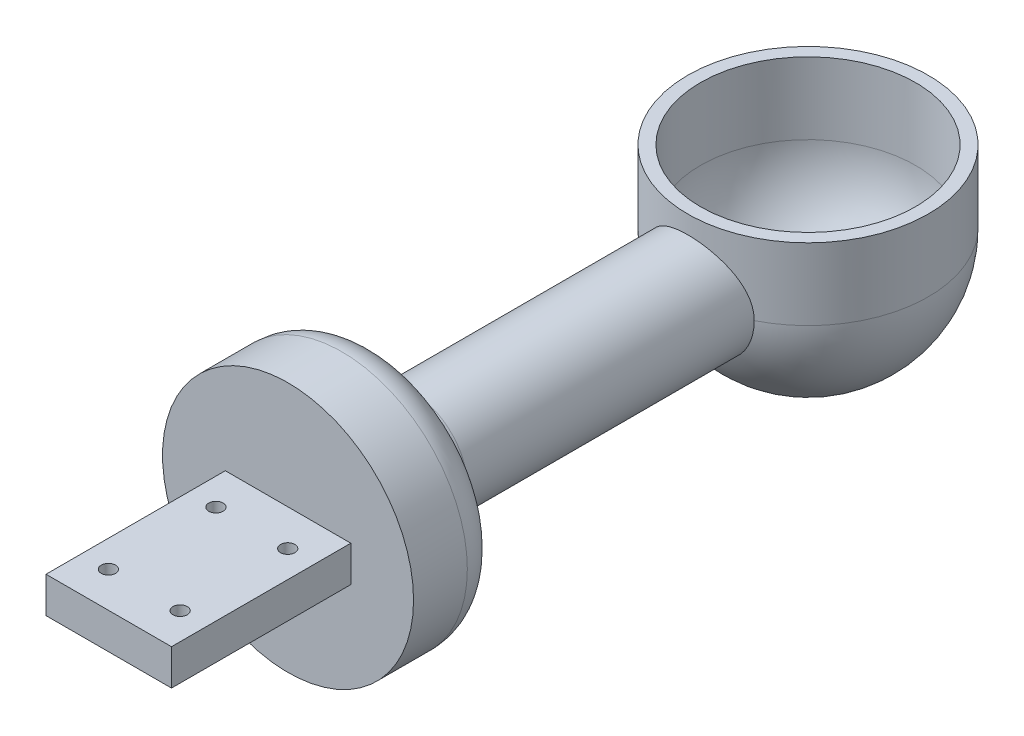
ISO-10303-21;
HEADER;
FILE_DESCRIPTION(('STEP AP214'),'2;1');
FILE_NAME('part.step','',(''),(''),'','','');
FILE_SCHEMA(('AUTOMOTIVE_DESIGN { 1 0 10303 214 1 1 1 1 }'));
ENDSEC;
DATA;
#1=APPLICATION_CONTEXT('core data for automotive mechanical design processes');
#2=APPLICATION_PROTOCOL_DEFINITION('international standard','automotive_design',2000,#1);
#3=PRODUCT_CONTEXT('',#1,'mechanical');
#4=PRODUCT('Part','Part','',(#3));
#5=PRODUCT_RELATED_PRODUCT_CATEGORY('part','',(#4));
#6=PRODUCT_DEFINITION_FORMATION('','',#4);
#7=PRODUCT_DEFINITION_CONTEXT('part definition',#1,'design');
#8=PRODUCT_DEFINITION('design','',#6,#7);
#9=PRODUCT_DEFINITION_SHAPE('','',#8);
#10=(LENGTH_UNIT() NAMED_UNIT(*) SI_UNIT(.MILLI.,.METRE.));
#11=(NAMED_UNIT(*) PLANE_ANGLE_UNIT() SI_UNIT($,.RADIAN.));
#12=(NAMED_UNIT(*) SI_UNIT($,.STERADIAN.) SOLID_ANGLE_UNIT());
#13=UNCERTAINTY_MEASURE_WITH_UNIT(LENGTH_MEASURE(1.E-05),#10,'distance_accuracy_value','');
#14=(GEOMETRIC_REPRESENTATION_CONTEXT(3) GLOBAL_UNCERTAINTY_ASSIGNED_CONTEXT((#13)) GLOBAL_UNIT_ASSIGNED_CONTEXT((#10,
#11,#12)) REPRESENTATION_CONTEXT('',''));
#15=CARTESIAN_POINT('',(0.,0.,0.));
#16=DIRECTION('',(0.,0.,1.));
#17=DIRECTION('',(1.,0.,0.));
#18=AXIS2_PLACEMENT_3D('',#15,#16,#17);
#19=CARTESIAN_POINT('',(0.,0.,-90.));
#20=DIRECTION('',(0.,0.,1.));
#21=DIRECTION('',(1.,0.,0.));
#22=AXIS2_PLACEMENT_3D('',#19,#20,#21);
#23=CYLINDRICAL_SURFACE('',#22,15.);
#24=CARTESIAN_POINT('',(0.,0.,-10.));
#25=DIRECTION('',(0.,0.,1.));
#26=DIRECTION('',(1.,0.,0.));
#27=AXIS2_PLACEMENT_3D('',#24,#25,#26);
#28=CIRCLE('',#27,15.);
#29=CARTESIAN_POINT('',(15.,0.,-10.));
#30=VERTEX_POINT('',#29);
#31=EDGE_CURVE('E11',#30,#30,#28,.F.);
#32=ORIENTED_EDGE('',*,*,#31,.T.);
#33=EDGE_LOOP('',(#32));
#34=FACE_BOUND('',#33,.T.);
#35=CARTESIAN_POINT('',(-15.,-1.04744440165294E-13,-90.));
#36=CARTESIAN_POINT('',(-15.0000011180629,0.199416589910186,-90.0000037148961));
#37=CARTESIAN_POINT('',(-14.9960224853218,0.398805978197176,-89.998010854561));
#38=CARTESIAN_POINT('',(-14.9801283069365,0.797180509822262,-89.9900704651956));
#39=CARTESIAN_POINT('',(-14.9682131159363,0.996165670824701,-89.9841231128713));
#40=CARTESIAN_POINT('',(-14.9206184180502,1.59173695595978,-89.9604179060455));
#41=CARTESIAN_POINT('',(-14.8730897168406,1.98722084661047,-89.9367967948438));
#42=CARTESIAN_POINT('',(-14.7473070501445,2.77009963093872,-89.8748978964644));
#43=CARTESIAN_POINT('',(-14.6691994107504,3.15752392799824,-89.8366899314931));
#44=CARTESIAN_POINT('',(-14.4831241955067,3.92357968353081,-89.7469047750654));
#45=CARTESIAN_POINT('',(-14.3751541255042,4.30221040468735,-89.6953264669215));
#46=CARTESIAN_POINT('',(-14.1306735404263,5.04753769249703,-89.5805614421511));
#47=CARTESIAN_POINT('',(-13.9942143462563,5.41425436699086,-89.5173956239988));
#48=CARTESIAN_POINT('',(-13.6937986230489,6.13450910976831,-89.3812628373903));
#49=CARTESIAN_POINT('',(-13.5298315317518,6.48804205189148,-89.3082921062736));
#50=CARTESIAN_POINT('',(-13.1755411058944,7.18028163573275,-89.1545396757981));
#51=CARTESIAN_POINT('',(-12.9851935588092,7.51897427649915,-89.0737508215976));
#52=CARTESIAN_POINT('',(-12.5795221840015,8.17960237846895,-88.9065320797501));
#53=CARTESIAN_POINT('',(-12.3641966284751,8.50153667821338,-88.8201018020499));
#54=CARTESIAN_POINT('',(-11.8950684339012,9.14750544243964,-88.6380057850135));
#55=CARTESIAN_POINT('',(-11.6396754045569,9.47031953458519,-88.5421047435388));
#56=CARTESIAN_POINT('',(-11.1035908057363,10.0935206330415,-88.3489114102079));
#57=CARTESIAN_POINT('',(-10.8229088968001,10.3939161239198,-88.2516196614616));
#58=CARTESIAN_POINT('',(-10.2374738340366,10.9710149380681,-88.0580335091681));
#59=CARTESIAN_POINT('',(-9.93270589967413,11.2477034929777,-87.9617397596895));
#60=CARTESIAN_POINT('',(-9.30093629991512,11.7754806430082,-87.7726628513661));
#61=CARTESIAN_POINT('',(-8.97394287218653,12.0265786377073,-87.6798784114617));
#62=CARTESIAN_POINT('',(-8.28183202582192,12.5139732304049,-87.4954460793731));
#63=CARTESIAN_POINT('',(-7.91561743238008,12.7488317132162,-87.4041054035966));
#64=CARTESIAN_POINT('',(-7.16253060249632,13.1866546295904,-87.2303880058701));
#65=CARTESIAN_POINT('',(-6.77565745487947,13.3896176547995,-87.1480116797931));
#66=CARTESIAN_POINT('',(-5.98395480508338,13.7616676742179,-86.9946250642922));
#67=CARTESIAN_POINT('',(-5.57913247255109,13.9307680483003,-86.9236102879106));
#68=CARTESIAN_POINT('',(-4.75433388647185,14.2333842203932,-86.7950237558998));
#69=CARTESIAN_POINT('',(-4.33435888193996,14.366902943779,-86.7374508951803));
#70=CARTESIAN_POINT('',(-3.50767666791516,14.590015936155,-86.6404573306008));
#71=CARTESIAN_POINT('',(-3.10164394955037,14.6817333584565,-86.6001675166512));
#72=CARTESIAN_POINT('',(-2.28220011512519,14.8312167328056,-86.5341894139035));
#73=CARTESIAN_POINT('',(-1.86878926467154,14.8889839045047,-86.5085006005705));
#74=CARTESIAN_POINT('',(-1.03808300988868,14.9698522016162,-86.4724715516371));
#75=CARTESIAN_POINT('',(-0.62078915128018,14.9929665733472,-86.4621254511746));
#76=CARTESIAN_POINT('',(0.214358016966454,15.0042801958997,-86.4570664608494));
#77=CARTESIAN_POINT('',(0.632211299970708,14.9924810537102,-86.462352851459));
#78=CARTESIAN_POINT('',(1.43580383130276,14.9361701374916,-86.4874856680707));
#79=CARTESIAN_POINT('',(1.82174313643298,14.8940066423059,-86.506286730574));
#80=CARTESIAN_POINT('',(2.58834742653606,14.7800746615488,-86.5567944485834));
#81=CARTESIAN_POINT('',(2.96901270566484,14.7083078340134,-86.5885003813068));
#82=CARTESIAN_POINT('',(3.72250973283779,14.5358971896879,-86.6640387868198));
#83=CARTESIAN_POINT('',(4.09534136451526,14.4352529442567,-86.7078714396117));
#84=CARTESIAN_POINT('',(4.83081047190126,14.2060426513355,-86.8066127438228));
#85=CARTESIAN_POINT('',(5.19344762024909,14.0774757083585,-86.861521750459));
#86=CARTESIAN_POINT('',(5.91179502253241,13.7913889952906,-86.9820453334529));
#87=CARTESIAN_POINT('',(6.26731691895285,13.6334598448268,-87.0478095880111));
#88=CARTESIAN_POINT('',(6.96367359048728,13.2912665259131,-87.1879076276429));
#89=CARTESIAN_POINT('',(7.30450834071185,13.1070023128372,-87.2622414272381));
#90=CARTESIAN_POINT('',(7.96980043256244,12.7134448464105,-87.4178114537079));
#91=CARTESIAN_POINT('',(8.29425570146961,12.5041484366291,-87.499048550678));
#92=CARTESIAN_POINT('',(8.92532349722544,12.0618054885513,-87.666654258308));
#93=CARTESIAN_POINT('',(9.23192903029872,11.828749738105,-87.7530248539127));
#94=CARTESIAN_POINT('',(9.84931358096797,11.3209177798672,-87.9359591333702));
#95=CARTESIAN_POINT('',(10.1585003269739,11.0442992315663,-88.0327883707272));
#96=CARTESIAN_POINT('',(10.7527219725689,10.4666463994513,-88.22773577681));
#97=CARTESIAN_POINT('',(11.0377559165426,10.1656111505022,-88.3258539963577));
#98=CARTESIAN_POINT('',(11.5822760248514,9.54058470286612,-88.5208867448796));
#99=CARTESIAN_POINT('',(11.8417483349736,9.21658121737168,-88.6178005965009));
#100=CARTESIAN_POINT('',(12.3334750963352,8.54738714704059,-88.8077751388214));
#101=CARTESIAN_POINT('',(12.5657252628454,8.20219323985374,-88.9008352214558));
#102=CARTESIAN_POINT('',(13.0108912191868,7.47699726433028,-89.0843536754966));
#103=CARTESIAN_POINT('',(13.222527327955,7.09613433575536,-89.1745230066981));
#104=CARTESIAN_POINT('',(13.6125368931575,6.31577560604006,-89.344753768404));
#105=CARTESIAN_POINT('',(13.7909250205786,5.91628812090955,-89.4248196520894));
#106=CARTESIAN_POINT('',(14.1125390816283,5.101728564824,-89.5719288688148));
#107=CARTESIAN_POINT('',(14.2558158726059,4.68668005094591,-89.638991007487));
#108=CARTESIAN_POINT('',(14.5058126992639,3.8437784282941,-89.7576367928758));
#109=CARTESIAN_POINT('',(14.6125489188063,3.41593107967774,-89.8092272907414));
#110=CARTESIAN_POINT('',(14.7995674188792,2.49428431295931,-89.9004117413249));
#111=CARTESIAN_POINT('',(14.874598763435,1.99914850582797,-89.9375704751888));
#112=CARTESIAN_POINT('',(14.9497623478576,1.25197348693031,-89.9749225599125));
#113=CARTESIAN_POINT('',(14.9685863308069,1.0021108723786,-89.9843089620925));
#114=CARTESIAN_POINT('',(14.9937082944507,0.501518332050936,-89.9968531555581));
#115=CARTESIAN_POINT('',(15.0000021267999,0.250788146560293,-90.0000088840576));
#116=CARTESIAN_POINT('',(15.,1.04003962709049E-13,-90.));
#117=B_SPLINE_CURVE_WITH_KNOTS('',3,(#35,#36,#37,#38,#39,#40,#41,#42,#43,#44,#45,#46,#47,#48,
#49,#50,#51,#52,#53,#54,#55,#56,#57,#58,#59,#60,#61,#62,#63,#64,#65,#66,#67,#68,#69,#70,#71,#72,
#73,#74,#75,#76,#77,#78,#79,#80,#81,#82,#83,#84,#85,#86,#87,#88,#89,#90,#91,#92,#93,#94,#95,#96,
#97,#98,#99,#100,#101,#102,#103,#104,#105,#106,#107,#108,#109,#110,#111,#112,#113,#114,#115,
#116),.UNSPECIFIED.,.F.,.F.,(4,2,2,2,2,2,2,2,2,2,2,2,2,2,2,2,2,2,2,2,2,2,2,2,2,2,2,2,2,2,2,2,2,
2,2,2,2,2,2,2,4),(0.,0.598146267561977,1.19626580883539,2.39166202418831,3.58140661379114,
4.77125060257797,5.95896939557434,7.14714528741016,8.33641902400184,9.52577507533965,
10.7923407861747,12.0584246944651,13.3252916672707,14.5916916217429,15.9236180490635,
17.255603271497,18.5870611544967,19.9184095367731,21.1713789173376,22.424303282647,
23.6767485850565,24.9291362411771,26.0938356669318,27.2584698685635,28.4231213583082,
29.5878102042034,30.7701558951799,31.9525035897263,33.1350005297013,34.3179577126978,
35.5945940567146,36.8712808877967,38.1486559099286,39.42623171996,40.7593549429063,
42.0918885126344,43.4224803992526,44.7524822004209,46.2555824752882,47.0074849758322,
47.7596363666754),.UNSPECIFIED.);
#118=CARTESIAN_POINT('',(-15.,-1.04744440165294E-13,-90.));
#119=VERTEX_POINT('',#118);
#120=CARTESIAN_POINT('',(15.,1.04744440165294E-13,-90.));
#121=VERTEX_POINT('',#120);
#122=EDGE_CURVE('E98',#119,#121,#117,.T.);
#123=ORIENTED_EDGE('',*,*,#122,.F.);
#124=CARTESIAN_POINT('',(0.,0.,-90.));
#125=DIRECTION('',(0.,0.,-1.));
#126=DIRECTION('',(-1.,0.,0.));
#127=AXIS2_PLACEMENT_3D('',#124,#125,#126);
#128=CIRCLE('',#127,15.);
#129=EDGE_CURVE('E107',#121,#119,#128,.T.);
#130=ORIENTED_EDGE('',*,*,#129,.F.);
#131=EDGE_LOOP('',(#123,#130));
#132=FACE_BOUND('',#131,.T.);
#133=ADVANCED_FACE('F39',(#34,#132),#23,.T.);
#134=CARTESIAN_POINT('',(0.,0.,25.));
#135=DIRECTION('',(0.,0.,1.));
#136=DIRECTION('',(1.,0.,0.));
#137=AXIS2_PLACEMENT_3D('',#134,#135,#136);
#138=PLANE('',#137);
#139=CARTESIAN_POINT('',(0.,0.,25.));
#140=DIRECTION('',(0.,0.,1.));
#141=DIRECTION('',(1.,0.,0.));
#142=AXIS2_PLACEMENT_3D('',#139,#140,#141);
#143=CIRCLE('',#142,35.);
#144=CARTESIAN_POINT('',(35.,0.,25.));
#145=VERTEX_POINT('',#144);
#146=EDGE_CURVE('E113',#145,#145,#143,.T.);
#147=ORIENTED_EDGE('',*,*,#146,.T.);
#148=EDGE_LOOP('',(#147));
#149=FACE_BOUND('',#148,.T.);
#150=DIRECTION('',(0.,-1.,0.));
#151=VECTOR('',#150,1.);
#152=CARTESIAN_POINT('',(17.5,5.,25.));
#153=LINE('',#152,#151);
#154=CARTESIAN_POINT('',(17.5,5.,25.));
#155=VERTEX_POINT('',#154);
#156=CARTESIAN_POINT('',(17.5,-5.,25.));
#157=VERTEX_POINT('',#156);
#158=EDGE_CURVE('E120',#155,#157,#153,.T.);
#159=ORIENTED_EDGE('',*,*,#158,.T.);
#160=DIRECTION('',(-1.,0.,0.));
#161=VECTOR('',#160,1.);
#162=CARTESIAN_POINT('',(-17.5,-5.,25.));
#163=LINE('',#162,#161);
#164=CARTESIAN_POINT('',(-17.5,-5.,25.));
#165=VERTEX_POINT('',#164);
#166=EDGE_CURVE('E215',#157,#165,#163,.T.);
#167=ORIENTED_EDGE('',*,*,#166,.T.);
#168=DIRECTION('',(0.,-1.,0.));
#169=VECTOR('',#168,1.);
#170=CARTESIAN_POINT('',(-17.5,5.,25.));
#171=LINE('',#170,#169);
#172=CARTESIAN_POINT('',(-17.5,5.,25.));
#173=VERTEX_POINT('',#172);
#174=EDGE_CURVE('E211',#173,#165,#171,.T.);
#175=ORIENTED_EDGE('',*,*,#174,.F.);
#176=DIRECTION('',(-1.,0.,0.));
#177=VECTOR('',#176,1.);
#178=CARTESIAN_POINT('',(-17.5,5.,25.));
#179=LINE('',#178,#177);
#180=EDGE_CURVE('E224',#155,#173,#179,.T.);
#181=ORIENTED_EDGE('',*,*,#180,.F.);
#182=EDGE_LOOP('',(#159,#167,#175,#181));
#183=FACE_BOUND('',#182,.T.);
#184=ADVANCED_FACE('F144',(#149,#183),#138,.T.);
#185=CARTESIAN_POINT('',(0.,0.,25.));
#186=DIRECTION('',(0.,0.,-1.));
#187=DIRECTION('',(-1.,0.,0.));
#188=AXIS2_PLACEMENT_3D('',#185,#186,#187);
#189=CYLINDRICAL_SURFACE('',#188,35.);
#190=CARTESIAN_POINT('',(0.,0.,10.));
#191=DIRECTION('',(0.,0.,1.));
#192=DIRECTION('',(1.,0.,0.));
#193=AXIS2_PLACEMENT_3D('',#190,#191,#192);
#194=CIRCLE('',#193,35.);
#195=CARTESIAN_POINT('',(35.,0.,10.));
#196=VERTEX_POINT('',#195);
#197=EDGE_CURVE('E49',#196,#196,#194,.T.);
#198=ORIENTED_EDGE('',*,*,#197,.T.);
#199=EDGE_LOOP('',(#198));
#200=FACE_BOUND('',#199,.T.);
#201=ORIENTED_EDGE('',*,*,#146,.F.);
#202=EDGE_LOOP('',(#201));
#203=FACE_BOUND('',#202,.T.);
#204=ADVANCED_FACE('F128',(#200,#203),#189,.T.);
#205=CARTESIAN_POINT('',(0.,0.,-9.99999999999999));
#206=DIRECTION('',(0.,0.,1.));
#207=DIRECTION('',(1.,0.,0.));
#208=AXIS2_PLACEMENT_3D('',#205,#206,#207);
#209=TOROIDAL_SURFACE('',#208,25.,10.);
#210=ORIENTED_EDGE('',*,*,#31,.F.);
#211=EDGE_LOOP('',(#210));
#212=FACE_BOUND('',#211,.T.);
#213=CARTESIAN_POINT('',(0.,0.,0.));
#214=DIRECTION('',(0.,0.,1.));
#215=DIRECTION('',(1.,0.,0.));
#216=AXIS2_PLACEMENT_3D('',#213,#214,#215);
#217=CIRCLE('',#216,25.);
#218=CARTESIAN_POINT('',(25.,0.,0.));
#219=VERTEX_POINT('',#218);
#220=EDGE_CURVE('E43',#219,#219,#217,.T.);
#221=ORIENTED_EDGE('',*,*,#220,.F.);
#222=EDGE_LOOP('',(#221));
#223=FACE_BOUND('',#222,.T.);
#224=ADVANCED_FACE('F41',(#212,#223),#209,.F.);
#225=CARTESIAN_POINT('',(0.,0.,10.));
#226=DIRECTION('',(0.,0.,1.));
#227=DIRECTION('',(1.,0.,0.));
#228=AXIS2_PLACEMENT_3D('',#225,#226,#227);
#229=TOROIDAL_SURFACE('',#228,25.,10.);
#230=ORIENTED_EDGE('',*,*,#220,.T.);
#231=EDGE_LOOP('',(#230));
#232=FACE_BOUND('',#231,.T.);
#233=ORIENTED_EDGE('',*,*,#197,.F.);
#234=EDGE_LOOP('',(#233));
#235=FACE_BOUND('',#234,.T.);
#236=ADVANCED_FACE('F131',(#232,#235),#229,.T.);
#237=CARTESIAN_POINT('',(0.,5.,0.));
#238=DIRECTION('',(0.,-1.,0.));
#239=DIRECTION('',(0.,0.,-1.));
#240=AXIS2_PLACEMENT_3D('',#237,#238,#239);
#241=PLANE('',#240);
#242=DIRECTION('',(0.,0.,-1.));
#243=VECTOR('',#242,1.);
#244=CARTESIAN_POINT('',(17.5,5.,75.));
#245=LINE('',#244,#243);
#246=CARTESIAN_POINT('',(17.5,5.,75.));
#247=VERTEX_POINT('',#246);
#248=EDGE_CURVE('E87',#247,#155,#245,.T.);
#249=ORIENTED_EDGE('',*,*,#248,.T.);
#250=ORIENTED_EDGE('',*,*,#180,.T.);
#251=DIRECTION('',(0.,0.,1.));
#252=VECTOR('',#251,1.);
#253=CARTESIAN_POINT('',(-17.5,5.,75.));
#254=LINE('',#253,#252);
#255=CARTESIAN_POINT('',(-17.5,5.,75.));
#256=VERTEX_POINT('',#255);
#257=EDGE_CURVE('E235',#173,#256,#254,.T.);
#258=ORIENTED_EDGE('',*,*,#257,.T.);
#259=DIRECTION('',(1.,0.,0.));
#260=VECTOR('',#259,1.);
#261=CARTESIAN_POINT('',(-17.5,5.,75.));
#262=LINE('',#261,#260);
#263=EDGE_CURVE('E65',#256,#247,#262,.T.);
#264=ORIENTED_EDGE('',*,*,#263,.T.);
#265=EDGE_LOOP('',(#249,#250,#258,#264));
#266=FACE_BOUND('',#265,.T.);
#267=CARTESIAN_POINT('',(-10.,5.,35.1));
#268=DIRECTION('',(0.,1.,0.));
#269=DIRECTION('',(0.,0.,1.));
#270=AXIS2_PLACEMENT_3D('',#267,#268,#269);
#271=CIRCLE('',#270,2.);
#272=CARTESIAN_POINT('',(-10.,5.,37.1));
#273=VERTEX_POINT('',#272);
#274=EDGE_CURVE('E244',#273,#273,#271,.T.);
#275=ORIENTED_EDGE('',*,*,#274,.F.);
#276=EDGE_LOOP('',(#275));
#277=FACE_BOUND('',#276,.T.);
#278=CARTESIAN_POINT('',(10.,5.,35.1));
#279=DIRECTION('',(0.,1.,0.));
#280=DIRECTION('',(0.,0.,1.));
#281=AXIS2_PLACEMENT_3D('',#278,#279,#280);
#282=CIRCLE('',#281,2.);
#283=CARTESIAN_POINT('',(10.,5.,37.1));
#284=VERTEX_POINT('',#283);
#285=EDGE_CURVE('E253',#284,#284,#282,.T.);
#286=ORIENTED_EDGE('',*,*,#285,.F.);
#287=EDGE_LOOP('',(#286));
#288=FACE_BOUND('',#287,.T.);
#289=CARTESIAN_POINT('',(10.,5.,65.1));
#290=DIRECTION('',(0.,1.,0.));
#291=DIRECTION('',(0.,0.,1.));
#292=AXIS2_PLACEMENT_3D('',#289,#290,#291);
#293=CIRCLE('',#292,2.);
#294=CARTESIAN_POINT('',(10.,5.,67.1));
#295=VERTEX_POINT('',#294);
#296=EDGE_CURVE('E260',#295,#295,#293,.T.);
#297=ORIENTED_EDGE('',*,*,#296,.F.);
#298=EDGE_LOOP('',(#297));
#299=FACE_BOUND('',#298,.T.);
#300=CARTESIAN_POINT('',(-10.,5.,65.1));
#301=DIRECTION('',(0.,1.,0.));
#302=DIRECTION('',(0.,0.,1.));
#303=AXIS2_PLACEMENT_3D('',#300,#301,#302);
#304=CIRCLE('',#303,2.);
#305=CARTESIAN_POINT('',(-10.,5.,67.1));
#306=VERTEX_POINT('',#305);
#307=EDGE_CURVE('E268',#306,#306,#304,.T.);
#308=ORIENTED_EDGE('',*,*,#307,.F.);
#309=EDGE_LOOP('',(#308));
#310=FACE_BOUND('',#309,.T.);
#311=ADVANCED_FACE('F133',(#266,#277,#288,#299,#310),#241,.F.);
#312=CARTESIAN_POINT('',(0.,-5.,0.));
#313=DIRECTION('',(0.,-1.,0.));
#314=DIRECTION('',(0.,0.,-1.));
#315=AXIS2_PLACEMENT_3D('',#312,#313,#314);
#316=PLANE('',#315);
#317=CARTESIAN_POINT('',(10.,-5.,65.1));
#318=DIRECTION('',(0.,1.,0.));
#319=DIRECTION('',(0.,0.,1.));
#320=AXIS2_PLACEMENT_3D('',#317,#318,#319);
#321=CIRCLE('',#320,2.);
#322=CARTESIAN_POINT('',(10.,-5.,67.1));
#323=VERTEX_POINT('',#322);
#324=EDGE_CURVE('E264',#323,#323,#321,.T.);
#325=ORIENTED_EDGE('',*,*,#324,.T.);
#326=EDGE_LOOP('',(#325));
#327=FACE_BOUND('',#326,.T.);
#328=CARTESIAN_POINT('',(-10.,-5.,35.1));
#329=DIRECTION('',(0.,1.,0.));
#330=DIRECTION('',(0.,0.,1.));
#331=AXIS2_PLACEMENT_3D('',#328,#329,#330);
#332=CIRCLE('',#331,2.);
#333=CARTESIAN_POINT('',(-10.,-5.,37.1));
#334=VERTEX_POINT('',#333);
#335=EDGE_CURVE('E249',#334,#334,#332,.T.);
#336=ORIENTED_EDGE('',*,*,#335,.T.);
#337=EDGE_LOOP('',(#336));
#338=FACE_BOUND('',#337,.T.);
#339=DIRECTION('',(0.,0.,-1.));
#340=VECTOR('',#339,1.);
#341=CARTESIAN_POINT('',(17.5,-5.,75.));
#342=LINE('',#341,#340);
#343=CARTESIAN_POINT('',(17.5,-5.,75.));
#344=VERTEX_POINT('',#343);
#345=EDGE_CURVE('E56',#344,#157,#342,.T.);
#346=ORIENTED_EDGE('',*,*,#345,.F.);
#347=DIRECTION('',(1.,0.,0.));
#348=VECTOR('',#347,1.);
#349=CARTESIAN_POINT('',(-17.5,-5.,75.));
#350=LINE('',#349,#348);
#351=CARTESIAN_POINT('',(-17.5,-5.,75.));
#352=VERTEX_POINT('',#351);
#353=EDGE_CURVE('E83',#352,#344,#350,.T.);
#354=ORIENTED_EDGE('',*,*,#353,.F.);
#355=DIRECTION('',(0.,0.,1.));
#356=VECTOR('',#355,1.);
#357=CARTESIAN_POINT('',(-17.5,-5.,75.));
#358=LINE('',#357,#356);
#359=EDGE_CURVE('E207',#165,#352,#358,.T.);
#360=ORIENTED_EDGE('',*,*,#359,.F.);
#361=ORIENTED_EDGE('',*,*,#166,.F.);
#362=EDGE_LOOP('',(#346,#354,#360,#361));
#363=FACE_BOUND('',#362,.T.);
#364=CARTESIAN_POINT('',(10.,-5.,35.1));
#365=DIRECTION('',(0.,1.,0.));
#366=DIRECTION('',(0.,0.,1.));
#367=AXIS2_PLACEMENT_3D('',#364,#365,#366);
#368=CIRCLE('',#367,2.);
#369=CARTESIAN_POINT('',(10.,-5.,37.1));
#370=VERTEX_POINT('',#369);
#371=EDGE_CURVE('E256',#370,#370,#368,.T.);
#372=ORIENTED_EDGE('',*,*,#371,.T.);
#373=EDGE_LOOP('',(#372));
#374=FACE_BOUND('',#373,.T.);
#375=CARTESIAN_POINT('',(-10.,-5.,65.1));
#376=DIRECTION('',(0.,1.,0.));
#377=DIRECTION('',(0.,0.,1.));
#378=AXIS2_PLACEMENT_3D('',#375,#376,#377);
#379=CIRCLE('',#378,2.);
#380=CARTESIAN_POINT('',(-10.,-5.,67.1));
#381=VERTEX_POINT('',#380);
#382=EDGE_CURVE('E103',#381,#381,#379,.T.);
#383=ORIENTED_EDGE('',*,*,#382,.T.);
#384=EDGE_LOOP('',(#383));
#385=FACE_BOUND('',#384,.T.);
#386=ADVANCED_FACE('F139',(#327,#338,#363,#374,#385),#316,.T.);
#387=CARTESIAN_POINT('',(17.5,5.,75.));
#388=DIRECTION('',(-1.,0.,0.));
#389=DIRECTION('',(0.,0.,1.));
#390=AXIS2_PLACEMENT_3D('',#387,#388,#389);
#391=PLANE('',#390);
#392=ORIENTED_EDGE('',*,*,#345,.T.);
#393=ORIENTED_EDGE('',*,*,#158,.F.);
#394=ORIENTED_EDGE('',*,*,#248,.F.);
#395=DIRECTION('',(0.,-1.,0.));
#396=VECTOR('',#395,1.);
#397=CARTESIAN_POINT('',(17.5,5.,75.));
#398=LINE('',#397,#396);
#399=EDGE_CURVE('E218',#247,#344,#398,.T.);
#400=ORIENTED_EDGE('',*,*,#399,.T.);
#401=EDGE_LOOP('',(#392,#393,#394,#400));
#402=FACE_BOUND('',#401,.T.);
#403=ADVANCED_FACE('F154',(#402),#391,.F.);
#404=CARTESIAN_POINT('',(-17.5,5.,75.));
#405=DIRECTION('',(1.,0.,0.));
#406=DIRECTION('',(0.,0.,-1.));
#407=AXIS2_PLACEMENT_3D('',#404,#405,#406);
#408=PLANE('',#407);
#409=ORIENTED_EDGE('',*,*,#359,.T.);
#410=DIRECTION('',(0.,-1.,0.));
#411=VECTOR('',#410,1.);
#412=CARTESIAN_POINT('',(-17.5,5.,75.));
#413=LINE('',#412,#411);
#414=EDGE_CURVE('E209',#256,#352,#413,.T.);
#415=ORIENTED_EDGE('',*,*,#414,.F.);
#416=ORIENTED_EDGE('',*,*,#257,.F.);
#417=ORIENTED_EDGE('',*,*,#174,.T.);
#418=EDGE_LOOP('',(#409,#415,#416,#417));
#419=FACE_BOUND('',#418,.T.);
#420=ADVANCED_FACE('F199',(#419),#408,.F.);
#421=CARTESIAN_POINT('',(-17.5,5.,75.));
#422=DIRECTION('',(0.,0.,-1.));
#423=DIRECTION('',(-1.,0.,0.));
#424=AXIS2_PLACEMENT_3D('',#421,#422,#423);
#425=PLANE('',#424);
#426=ORIENTED_EDGE('',*,*,#353,.T.);
#427=ORIENTED_EDGE('',*,*,#399,.F.);
#428=ORIENTED_EDGE('',*,*,#263,.F.);
#429=ORIENTED_EDGE('',*,*,#414,.T.);
#430=EDGE_LOOP('',(#426,#427,#428,#429));
#431=FACE_BOUND('',#430,.T.);
#432=ADVANCED_FACE('F192',(#431),#425,.F.);
#433=CARTESIAN_POINT('',(-10.,5.,35.1));
#434=DIRECTION('',(0.,-1.,0.));
#435=DIRECTION('',(0.,0.,-1.));
#436=AXIS2_PLACEMENT_3D('',#433,#434,#435);
#437=CYLINDRICAL_SURFACE('',#436,2.);
#438=ORIENTED_EDGE('',*,*,#274,.T.);
#439=EDGE_LOOP('',(#438));
#440=FACE_BOUND('',#439,.T.);
#441=ORIENTED_EDGE('',*,*,#335,.F.);
#442=EDGE_LOOP('',(#441));
#443=FACE_BOUND('',#442,.T.);
#444=ADVANCED_FACE('F189',(#440,#443),#437,.F.);
#445=CARTESIAN_POINT('',(10.,5.,35.1));
#446=DIRECTION('',(0.,-1.,0.));
#447=DIRECTION('',(0.,0.,-1.));
#448=AXIS2_PLACEMENT_3D('',#445,#446,#447);
#449=CYLINDRICAL_SURFACE('',#448,2.);
#450=ORIENTED_EDGE('',*,*,#285,.T.);
#451=EDGE_LOOP('',(#450));
#452=FACE_BOUND('',#451,.T.);
#453=ORIENTED_EDGE('',*,*,#371,.F.);
#454=EDGE_LOOP('',(#453));
#455=FACE_BOUND('',#454,.T.);
#456=ADVANCED_FACE('F185',(#452,#455),#449,.F.);
#457=CARTESIAN_POINT('',(10.,5.,65.1));
#458=DIRECTION('',(0.,-1.,0.));
#459=DIRECTION('',(0.,0.,-1.));
#460=AXIS2_PLACEMENT_3D('',#457,#458,#459);
#461=CYLINDRICAL_SURFACE('',#460,2.);
#462=ORIENTED_EDGE('',*,*,#296,.T.);
#463=EDGE_LOOP('',(#462));
#464=FACE_BOUND('',#463,.T.);
#465=ORIENTED_EDGE('',*,*,#324,.F.);
#466=EDGE_LOOP('',(#465));
#467=FACE_BOUND('',#466,.T.);
#468=ADVANCED_FACE('F181',(#464,#467),#461,.F.);
#469=CARTESIAN_POINT('',(-10.,5.,65.1));
#470=DIRECTION('',(0.,-1.,0.));
#471=DIRECTION('',(0.,0.,-1.));
#472=AXIS2_PLACEMENT_3D('',#469,#470,#471);
#473=CYLINDRICAL_SURFACE('',#472,2.);
#474=ORIENTED_EDGE('',*,*,#307,.T.);
#475=EDGE_LOOP('',(#474));
#476=FACE_BOUND('',#475,.T.);
#477=ORIENTED_EDGE('',*,*,#382,.F.);
#478=EDGE_LOOP('',(#477));
#479=FACE_BOUND('',#478,.T.);
#480=ADVANCED_FACE('F178',(#476,#479),#473,.F.);
#481=CARTESIAN_POINT('',(0.,0.,-120.));
#482=DIRECTION('',(0.,0.,-1.));
#483=DIRECTION('',(1.,0.,0.));
#484=AXIS2_PLACEMENT_3D('',#481,#482,#483);
#485=SPHERICAL_SURFACE('',#484,33.5410196624968);
#486=CARTESIAN_POINT('',(0.,0.,-120.));
#487=DIRECTION('',(0.,-1.,0.));
#488=DIRECTION('',(0.,0.,1.));
#489=AXIS2_PLACEMENT_3D('',#486,#487,#488);
#490=CIRCLE('',#489,33.5410196624968);
#491=EDGE_CURVE('E95',#119,#121,#490,.T.);
#492=ORIENTED_EDGE('',*,*,#491,.T.);
#493=ORIENTED_EDGE('',*,*,#129,.T.);
#494=EDGE_LOOP('',(#492,#493));
#495=FACE_BOUND('',#494,.T.);
#496=ADVANCED_FACE('F111',(#495),#485,.T.);
#497=CARTESIAN_POINT('',(-1.28637432361399E-13,20.,-120.));
#498=DIRECTION('',(0.,-1.,0.));
#499=DIRECTION('',(1.,0.,0.));
#500=AXIS2_PLACEMENT_3D('',#497,#498,#499);
#501=CYLINDRICAL_SURFACE('',#500,33.5410196624969);
#502=CARTESIAN_POINT('',(-1.28637432361399E-13,20.,-120.));
#503=DIRECTION('',(0.,1.,0.));
#504=DIRECTION('',(-1.,0.,0.));
#505=AXIS2_PLACEMENT_3D('',#502,#503,#504);
#506=CIRCLE('',#505,33.5410196624969);
#507=CARTESIAN_POINT('',(-33.541019662497,19.9999999999998,-120.));
#508=VERTEX_POINT('',#507);
#509=EDGE_CURVE('E109',#508,#508,#506,.T.);
#510=ORIENTED_EDGE('',*,*,#509,.F.);
#511=EDGE_LOOP('',(#510));
#512=FACE_BOUND('',#511,.T.);
#513=ORIENTED_EDGE('',*,*,#491,.F.);
#514=ORIENTED_EDGE('',*,*,#122,.T.);
#515=EDGE_LOOP('',(#513,#514));
#516=FACE_BOUND('',#515,.T.);
#517=ADVANCED_FACE('F97',(#512,#516),#501,.T.);
#518=CARTESIAN_POINT('',(-1.28637432361399E-13,20.,-120.));
#519=DIRECTION('',(0.,1.,0.));
#520=DIRECTION('',(-1.,0.,0.));
#521=AXIS2_PLACEMENT_3D('',#518,#519,#520);
#522=PLANE('',#521);
#523=ORIENTED_EDGE('',*,*,#509,.T.);
#524=EDGE_LOOP('',(#523));
#525=FACE_BOUND('',#524,.T.);
#526=CARTESIAN_POINT('',(-1.28637432361399E-13,20.,-120.));
#527=DIRECTION('',(0.,1.,0.));
#528=DIRECTION('',(-1.,0.,0.));
#529=AXIS2_PLACEMENT_3D('',#526,#527,#528);
#530=CIRCLE('',#529,30.);
#531=CARTESIAN_POINT('',(-30.0000000000001,19.9999999999998,-120.));
#532=VERTEX_POINT('',#531);
#533=EDGE_CURVE('E280',#532,#532,#530,.T.);
#534=ORIENTED_EDGE('',*,*,#533,.F.);
#535=EDGE_LOOP('',(#534));
#536=FACE_BOUND('',#535,.T.);
#537=ADVANCED_FACE('F168',(#525,#536),#522,.T.);
#538=CARTESIAN_POINT('',(-1.28637432361399E-13,20.,-120.));
#539=DIRECTION('',(0.,-1.,0.));
#540=DIRECTION('',(1.,0.,0.));
#541=AXIS2_PLACEMENT_3D('',#538,#539,#540);
#542=CYLINDRICAL_SURFACE('',#541,30.);
#543=ORIENTED_EDGE('',*,*,#533,.T.);
#544=EDGE_LOOP('',(#543));
#545=FACE_BOUND('',#544,.T.);
#546=CARTESIAN_POINT('',(0.,0.,-120.));
#547=DIRECTION('',(0.,1.,0.));
#548=DIRECTION('',(0.,0.,1.));
#549=AXIS2_PLACEMENT_3D('',#546,#547,#548);
#550=CIRCLE('',#549,30.);
#551=CARTESIAN_POINT('',(0.,0.,-90.));
#552=VERTEX_POINT('',#551);
#553=EDGE_CURVE('E104',#552,#552,#550,.T.);
#554=ORIENTED_EDGE('',*,*,#553,.F.);
#555=EDGE_LOOP('',(#554));
#556=FACE_BOUND('',#555,.T.);
#557=ADVANCED_FACE('F174',(#545,#556),#542,.F.);
#558=CARTESIAN_POINT('',(0.,0.,-120.));
#559=DIRECTION('',(0.,0.,-1.));
#560=DIRECTION('',(-1.,0.,0.));
#561=AXIS2_PLACEMENT_3D('',#558,#559,#560);
#562=SPHERICAL_SURFACE('',#561,30.);
#563=CARTESIAN_POINT('',(0.,0.,-120.));
#564=DIRECTION('',(0.,1.,0.));
#565=DIRECTION('',(0.,0.,1.));
#566=AXIS2_PLACEMENT_3D('',#563,#564,#565);
#567=SPHERICAL_SURFACE('',#566,30.);
#568=ORIENTED_EDGE('',*,*,#553,.T.);
#569=EDGE_LOOP('',(#568));
#570=FACE_BOUND('',#569,.T.);
#571=ADVANCED_FACE('F171',(#570),#567,.F.);
#572=CLOSED_SHELL('',(#133,#184,#204,#224,#236,#311,#386,#403,#420,#432,#444,#456,#468,#480,
#496,#517,#537,#557,#571));
#573=MANIFOLD_SOLID_BREP('B2',#572);
#574=ADVANCED_BREP_SHAPE_REPRESENTATION('',(#18,#573),#14);
#575=SHAPE_DEFINITION_REPRESENTATION(#9,#574);
ENDSEC;
END-ISO-10303-21;
